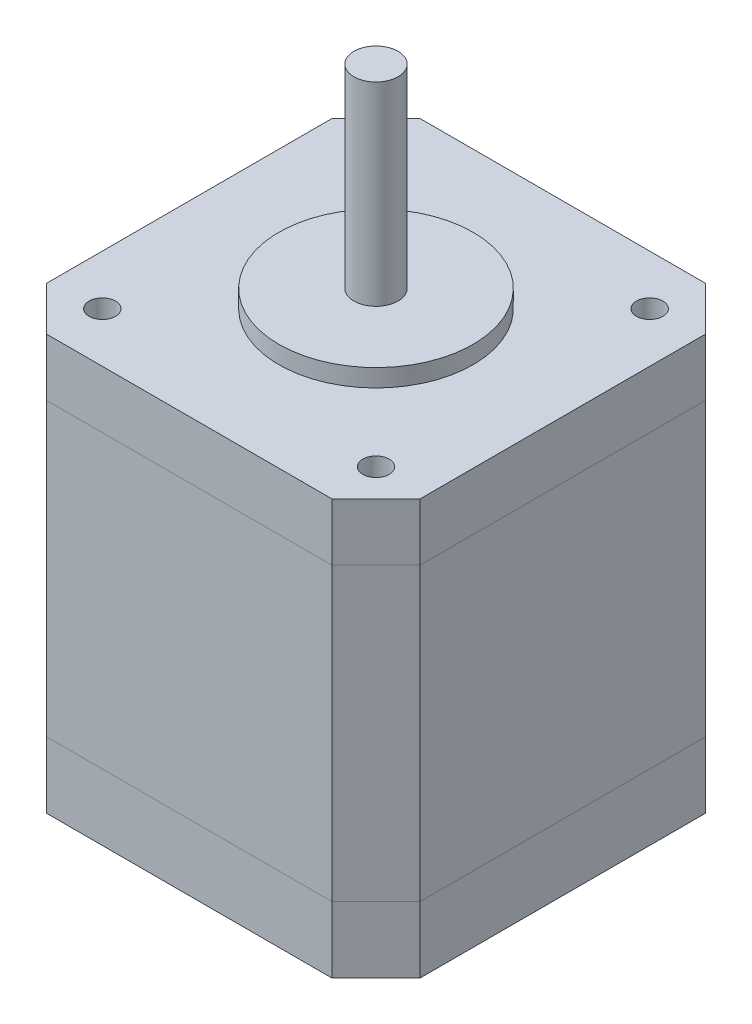
ISO-10303-21;
HEADER;
FILE_DESCRIPTION(('STEP AP214'),'2;1');
FILE_NAME('part.step','',(''),(''),'','','');
FILE_SCHEMA(('AUTOMOTIVE_DESIGN { 1 0 10303 214 1 1 1 1 }'));
ENDSEC;
DATA;
#1=APPLICATION_CONTEXT('core data for automotive mechanical design processes');
#2=APPLICATION_PROTOCOL_DEFINITION('international standard','automotive_design',2000,#1);
#3=PRODUCT_CONTEXT('',#1,'mechanical');
#4=PRODUCT('Part','Part','',(#3));
#5=PRODUCT_RELATED_PRODUCT_CATEGORY('part','',(#4));
#6=PRODUCT_DEFINITION_FORMATION('','',#4);
#7=PRODUCT_DEFINITION_CONTEXT('part definition',#1,'design');
#8=PRODUCT_DEFINITION('design','',#6,#7);
#9=PRODUCT_DEFINITION_SHAPE('','',#8);
#10=(LENGTH_UNIT() NAMED_UNIT(*) SI_UNIT(.MILLI.,.METRE.));
#11=(NAMED_UNIT(*) PLANE_ANGLE_UNIT() SI_UNIT($,.RADIAN.));
#12=(NAMED_UNIT(*) SI_UNIT($,.STERADIAN.) SOLID_ANGLE_UNIT());
#13=UNCERTAINTY_MEASURE_WITH_UNIT(LENGTH_MEASURE(1.E-05),#10,'distance_accuracy_value','');
#14=(GEOMETRIC_REPRESENTATION_CONTEXT(3) GLOBAL_UNCERTAINTY_ASSIGNED_CONTEXT((#13)) GLOBAL_UNIT_ASSIGNED_CONTEXT((#10,
#11,#12)) REPRESENTATION_CONTEXT('',''));
#15=CARTESIAN_POINT('',(0.,0.,0.));
#16=DIRECTION('',(0.,0.,1.));
#17=DIRECTION('',(1.,0.,0.));
#18=AXIS2_PLACEMENT_3D('',#15,#16,#17);
#19=CARTESIAN_POINT('',(-21.15,40.5,-16.15));
#20=DIRECTION('',(-1.,0.,0.));
#21=DIRECTION('',(0.,0.,1.));
#22=AXIS2_PLACEMENT_3D('',#19,#20,#21);
#23=PLANE('',#22);
#24=DIRECTION('',(0.,0.,-1.));
#25=VECTOR('',#24,1.);
#26=CARTESIAN_POINT('',(-21.15,7.5,-16.15));
#27=LINE('',#26,#25);
#28=CARTESIAN_POINT('',(-21.15,7.5,16.15));
#29=VERTEX_POINT('',#28);
#30=CARTESIAN_POINT('',(-21.15,7.5,-16.15));
#31=VERTEX_POINT('',#30);
#32=EDGE_CURVE('E140',#29,#31,#27,.T.);
#33=ORIENTED_EDGE('',*,*,#32,.F.);
#34=DIRECTION('',(0.,-1.,0.));
#35=VECTOR('',#34,1.);
#36=CARTESIAN_POINT('',(-21.15,40.5,16.15));
#37=LINE('',#36,#35);
#38=CARTESIAN_POINT('',(-21.15,40.5,16.15));
#39=VERTEX_POINT('',#38);
#40=EDGE_CURVE('E12',#39,#29,#37,.T.);
#41=ORIENTED_EDGE('',*,*,#40,.F.);
#42=DIRECTION('',(0.,0.,-1.));
#43=VECTOR('',#42,1.);
#44=CARTESIAN_POINT('',(-21.15,40.5,-16.15));
#45=LINE('',#44,#43);
#46=CARTESIAN_POINT('',(-21.15,40.5,-16.15));
#47=VERTEX_POINT('',#46);
#48=EDGE_CURVE('E160',#39,#47,#45,.T.);
#49=ORIENTED_EDGE('',*,*,#48,.T.);
#50=DIRECTION('',(0.,-1.,0.));
#51=VECTOR('',#50,1.);
#52=CARTESIAN_POINT('',(-21.15,40.5,-16.15));
#53=LINE('',#52,#51);
#54=EDGE_CURVE('E46',#47,#31,#53,.T.);
#55=ORIENTED_EDGE('',*,*,#54,.T.);
#56=EDGE_LOOP('',(#33,#41,#49,#55));
#57=FACE_BOUND('',#56,.T.);
#58=ADVANCED_FACE('F43',(#57),#23,.T.);
#59=CARTESIAN_POINT('',(-21.15,40.5,16.15));
#60=DIRECTION('',(-0.707106781186547,0.,0.707106781186547));
#61=DIRECTION('',(0.707106781186548,0.,0.707106781186548));
#62=AXIS2_PLACEMENT_3D('',#59,#60,#61);
#63=PLANE('',#62);
#64=DIRECTION('',(-0.707106781186548,0.,-0.707106781186548));
#65=VECTOR('',#64,1.);
#66=CARTESIAN_POINT('',(-21.15,7.5,16.15));
#67=LINE('',#66,#65);
#68=CARTESIAN_POINT('',(-16.15,7.5,21.15));
#69=VERTEX_POINT('',#68);
#70=EDGE_CURVE('E158',#69,#29,#67,.T.);
#71=ORIENTED_EDGE('',*,*,#70,.F.);
#72=DIRECTION('',(0.,-1.,0.));
#73=VECTOR('',#72,1.);
#74=CARTESIAN_POINT('',(-16.15,40.5,21.15));
#75=LINE('',#74,#73);
#76=CARTESIAN_POINT('',(-16.15,40.5,21.15));
#77=VERTEX_POINT('',#76);
#78=EDGE_CURVE('E52',#77,#69,#75,.T.);
#79=ORIENTED_EDGE('',*,*,#78,.F.);
#80=DIRECTION('',(-0.707106781186548,0.,-0.707106781186548));
#81=VECTOR('',#80,1.);
#82=CARTESIAN_POINT('',(-21.15,40.5,16.15));
#83=LINE('',#82,#81);
#84=EDGE_CURVE('E130',#77,#39,#83,.T.);
#85=ORIENTED_EDGE('',*,*,#84,.T.);
#86=ORIENTED_EDGE('',*,*,#40,.T.);
#87=EDGE_LOOP('',(#71,#79,#85,#86));
#88=FACE_BOUND('',#87,.T.);
#89=ADVANCED_FACE('F172',(#88),#63,.T.);
#90=CARTESIAN_POINT('',(-16.15,40.5,21.15));
#91=DIRECTION('',(0.,0.,1.));
#92=DIRECTION('',(1.,0.,0.));
#93=AXIS2_PLACEMENT_3D('',#90,#91,#92);
#94=PLANE('',#93);
#95=DIRECTION('',(-1.,0.,0.));
#96=VECTOR('',#95,1.);
#97=CARTESIAN_POINT('',(-16.15,7.5,21.15));
#98=LINE('',#97,#96);
#99=CARTESIAN_POINT('',(16.15,7.5,21.15));
#100=VERTEX_POINT('',#99);
#101=EDGE_CURVE('E117',#100,#69,#98,.T.);
#102=ORIENTED_EDGE('',*,*,#101,.F.);
#103=DIRECTION('',(0.,-1.,0.));
#104=VECTOR('',#103,1.);
#105=CARTESIAN_POINT('',(16.15,40.5,21.15));
#106=LINE('',#105,#104);
#107=CARTESIAN_POINT('',(16.15,40.5,21.15));
#108=VERTEX_POINT('',#107);
#109=EDGE_CURVE('E112',#108,#100,#106,.T.);
#110=ORIENTED_EDGE('',*,*,#109,.F.);
#111=DIRECTION('',(-1.,0.,0.));
#112=VECTOR('',#111,1.);
#113=CARTESIAN_POINT('',(-16.15,40.5,21.15));
#114=LINE('',#113,#112);
#115=EDGE_CURVE('E115',#108,#77,#114,.T.);
#116=ORIENTED_EDGE('',*,*,#115,.T.);
#117=ORIENTED_EDGE('',*,*,#78,.T.);
#118=EDGE_LOOP('',(#102,#110,#116,#117));
#119=FACE_BOUND('',#118,.T.);
#120=ADVANCED_FACE('F114',(#119),#94,.T.);
#121=CARTESIAN_POINT('',(16.15,40.5,21.15));
#122=DIRECTION('',(0.707106781186547,0.,0.707106781186547));
#123=DIRECTION('',(0.707106781186548,0.,-0.707106781186548));
#124=AXIS2_PLACEMENT_3D('',#121,#122,#123);
#125=PLANE('',#124);
#126=DIRECTION('',(-0.707106781186548,0.,0.707106781186548));
#127=VECTOR('',#126,1.);
#128=CARTESIAN_POINT('',(16.15,7.5,21.15));
#129=LINE('',#128,#127);
#130=CARTESIAN_POINT('',(21.15,7.5,16.15));
#131=VERTEX_POINT('',#130);
#132=EDGE_CURVE('E155',#131,#100,#129,.T.);
#133=ORIENTED_EDGE('',*,*,#132,.F.);
#134=DIRECTION('',(0.,-1.,0.));
#135=VECTOR('',#134,1.);
#136=CARTESIAN_POINT('',(21.15,40.5,16.15));
#137=LINE('',#136,#135);
#138=CARTESIAN_POINT('',(21.15,40.5,16.15));
#139=VERTEX_POINT('',#138);
#140=EDGE_CURVE('E122',#139,#131,#137,.T.);
#141=ORIENTED_EDGE('',*,*,#140,.F.);
#142=DIRECTION('',(-0.707106781186548,0.,0.707106781186548));
#143=VECTOR('',#142,1.);
#144=CARTESIAN_POINT('',(16.15,40.5,21.15));
#145=LINE('',#144,#143);
#146=EDGE_CURVE('E128',#139,#108,#145,.T.);
#147=ORIENTED_EDGE('',*,*,#146,.T.);
#148=ORIENTED_EDGE('',*,*,#109,.T.);
#149=EDGE_LOOP('',(#133,#141,#147,#148));
#150=FACE_BOUND('',#149,.T.);
#151=ADVANCED_FACE('F132',(#150),#125,.T.);
#152=CARTESIAN_POINT('',(21.15,40.5,16.15));
#153=DIRECTION('',(1.,0.,0.));
#154=DIRECTION('',(0.,0.,-1.));
#155=AXIS2_PLACEMENT_3D('',#152,#153,#154);
#156=PLANE('',#155);
#157=DIRECTION('',(0.,0.,1.));
#158=VECTOR('',#157,1.);
#159=CARTESIAN_POINT('',(21.15,7.5,16.15));
#160=LINE('',#159,#158);
#161=CARTESIAN_POINT('',(21.15,7.5,-16.15));
#162=VERTEX_POINT('',#161);
#163=EDGE_CURVE('E152',#162,#131,#160,.T.);
#164=ORIENTED_EDGE('',*,*,#163,.F.);
#165=DIRECTION('',(0.,-1.,0.));
#166=VECTOR('',#165,1.);
#167=CARTESIAN_POINT('',(21.15,40.5,-16.15));
#168=LINE('',#167,#166);
#169=CARTESIAN_POINT('',(21.15,40.5,-16.15));
#170=VERTEX_POINT('',#169);
#171=EDGE_CURVE('E164',#170,#162,#168,.T.);
#172=ORIENTED_EDGE('',*,*,#171,.F.);
#173=DIRECTION('',(0.,0.,1.));
#174=VECTOR('',#173,1.);
#175=CARTESIAN_POINT('',(21.15,40.5,16.15));
#176=LINE('',#175,#174);
#177=EDGE_CURVE('E133',#170,#139,#176,.T.);
#178=ORIENTED_EDGE('',*,*,#177,.T.);
#179=ORIENTED_EDGE('',*,*,#140,.T.);
#180=EDGE_LOOP('',(#164,#172,#178,#179));
#181=FACE_BOUND('',#180,.T.);
#182=ADVANCED_FACE('F185',(#181),#156,.T.);
#183=CARTESIAN_POINT('',(21.15,40.5,-16.15));
#184=DIRECTION('',(0.707106781186547,0.,-0.707106781186547));
#185=DIRECTION('',(-0.707106781186548,0.,-0.707106781186548));
#186=AXIS2_PLACEMENT_3D('',#183,#184,#185);
#187=PLANE('',#186);
#188=DIRECTION('',(0.707106781186548,0.,0.707106781186548));
#189=VECTOR('',#188,1.);
#190=CARTESIAN_POINT('',(21.15,7.5,-16.15));
#191=LINE('',#190,#189);
#192=CARTESIAN_POINT('',(16.15,7.5,-21.15));
#193=VERTEX_POINT('',#192);
#194=EDGE_CURVE('E149',#193,#162,#191,.T.);
#195=ORIENTED_EDGE('',*,*,#194,.F.);
#196=DIRECTION('',(0.,-1.,0.));
#197=VECTOR('',#196,1.);
#198=CARTESIAN_POINT('',(16.15,40.5,-21.15));
#199=LINE('',#198,#197);
#200=CARTESIAN_POINT('',(16.15,40.5,-21.15));
#201=VERTEX_POINT('',#200);
#202=EDGE_CURVE('E166',#201,#193,#199,.T.);
#203=ORIENTED_EDGE('',*,*,#202,.F.);
#204=DIRECTION('',(0.707106781186548,0.,0.707106781186548));
#205=VECTOR('',#204,1.);
#206=CARTESIAN_POINT('',(21.15,40.5,-16.15));
#207=LINE('',#206,#205);
#208=EDGE_CURVE('E135',#201,#170,#207,.T.);
#209=ORIENTED_EDGE('',*,*,#208,.T.);
#210=ORIENTED_EDGE('',*,*,#171,.T.);
#211=EDGE_LOOP('',(#195,#203,#209,#210));
#212=FACE_BOUND('',#211,.T.);
#213=ADVANCED_FACE('F188',(#212),#187,.T.);
#214=CARTESIAN_POINT('',(16.15,40.5,-21.15));
#215=DIRECTION('',(0.,0.,-1.));
#216=DIRECTION('',(-1.,0.,0.));
#217=AXIS2_PLACEMENT_3D('',#214,#215,#216);
#218=PLANE('',#217);
#219=DIRECTION('',(1.,0.,0.));
#220=VECTOR('',#219,1.);
#221=CARTESIAN_POINT('',(16.15,7.5,-21.15));
#222=LINE('',#221,#220);
#223=CARTESIAN_POINT('',(-16.15,7.5,-21.15));
#224=VERTEX_POINT('',#223);
#225=EDGE_CURVE('E146',#224,#193,#222,.T.);
#226=ORIENTED_EDGE('',*,*,#225,.F.);
#227=DIRECTION('',(0.,-1.,0.));
#228=VECTOR('',#227,1.);
#229=CARTESIAN_POINT('',(-16.15,40.5,-21.15));
#230=LINE('',#229,#228);
#231=CARTESIAN_POINT('',(-16.15,40.5,-21.15));
#232=VERTEX_POINT('',#231);
#233=EDGE_CURVE('E167',#232,#224,#230,.T.);
#234=ORIENTED_EDGE('',*,*,#233,.F.);
#235=DIRECTION('',(1.,0.,0.));
#236=VECTOR('',#235,1.);
#237=CARTESIAN_POINT('',(16.15,40.5,-21.15));
#238=LINE('',#237,#236);
#239=EDGE_CURVE('E263',#232,#201,#238,.T.);
#240=ORIENTED_EDGE('',*,*,#239,.T.);
#241=ORIENTED_EDGE('',*,*,#202,.T.);
#242=EDGE_LOOP('',(#226,#234,#240,#241));
#243=FACE_BOUND('',#242,.T.);
#244=ADVANCED_FACE('F192',(#243),#218,.T.);
#245=CARTESIAN_POINT('',(-16.15,40.5,-21.15));
#246=DIRECTION('',(-0.707106781186547,0.,-0.707106781186547));
#247=DIRECTION('',(-0.707106781186548,0.,0.707106781186548));
#248=AXIS2_PLACEMENT_3D('',#245,#246,#247);
#249=PLANE('',#248);
#250=DIRECTION('',(0.707106781186548,0.,-0.707106781186548));
#251=VECTOR('',#250,1.);
#252=CARTESIAN_POINT('',(-16.15,7.5,-21.15));
#253=LINE('',#252,#251);
#254=EDGE_CURVE('E143',#31,#224,#253,.T.);
#255=ORIENTED_EDGE('',*,*,#254,.F.);
#256=ORIENTED_EDGE('',*,*,#54,.F.);
#257=DIRECTION('',(0.707106781186548,0.,-0.707106781186548));
#258=VECTOR('',#257,1.);
#259=CARTESIAN_POINT('',(-16.15,40.5,-21.15));
#260=LINE('',#259,#258);
#261=EDGE_CURVE('E264',#47,#232,#260,.T.);
#262=ORIENTED_EDGE('',*,*,#261,.T.);
#263=ORIENTED_EDGE('',*,*,#233,.T.);
#264=EDGE_LOOP('',(#255,#256,#262,#263));
#265=FACE_BOUND('',#264,.T.);
#266=ADVANCED_FACE('F169',(#265),#249,.T.);
#267=CARTESIAN_POINT('',(-21.15,40.5,21.15));
#268=DIRECTION('',(0.,1.,0.));
#269=DIRECTION('',(0.,0.,1.));
#270=AXIS2_PLACEMENT_3D('',#267,#268,#269);
#271=PLANE('',#270);
#272=ORIENTED_EDGE('',*,*,#48,.F.);
#273=ORIENTED_EDGE('',*,*,#84,.F.);
#274=ORIENTED_EDGE('',*,*,#115,.F.);
#275=ORIENTED_EDGE('',*,*,#146,.F.);
#276=ORIENTED_EDGE('',*,*,#177,.F.);
#277=ORIENTED_EDGE('',*,*,#208,.F.);
#278=ORIENTED_EDGE('',*,*,#239,.F.);
#279=ORIENTED_EDGE('',*,*,#261,.F.);
#280=EDGE_LOOP('',(#272,#273,#274,#275,#276,#277,#278,#279));
#281=FACE_BOUND('',#280,.T.);
#282=ADVANCED_FACE('F126',(#281),#271,.T.);
#283=CARTESIAN_POINT('',(-21.15,7.5,21.15));
#284=DIRECTION('',(0.,1.,0.));
#285=DIRECTION('',(0.,0.,1.));
#286=AXIS2_PLACEMENT_3D('',#283,#284,#285);
#287=PLANE('',#286);
#288=ORIENTED_EDGE('',*,*,#32,.T.);
#289=ORIENTED_EDGE('',*,*,#254,.T.);
#290=ORIENTED_EDGE('',*,*,#225,.T.);
#291=ORIENTED_EDGE('',*,*,#194,.T.);
#292=ORIENTED_EDGE('',*,*,#163,.T.);
#293=ORIENTED_EDGE('',*,*,#132,.T.);
#294=ORIENTED_EDGE('',*,*,#101,.T.);
#295=ORIENTED_EDGE('',*,*,#70,.T.);
#296=EDGE_LOOP('',(#288,#289,#290,#291,#292,#293,#294,#295));
#297=FACE_BOUND('',#296,.T.);
#298=ADVANCED_FACE('F171',(#297),#287,.F.);
#299=CLOSED_SHELL('',(#58,#89,#120,#151,#182,#213,#244,#266,#282,#298));
#300=MANIFOLD_SOLID_BREP('B2',#299);
#301=CARTESIAN_POINT('',(0.,49.,0.));
#302=DIRECTION('',(0.,1.,0.));
#303=DIRECTION('',(0.,0.,1.));
#304=AXIS2_PLACEMENT_3D('',#301,#302,#303);
#305=PLANE('',#304);
#306=CARTESIAN_POINT('',(0.,49.,0.));
#307=DIRECTION('',(0.,1.,0.));
#308=DIRECTION('',(0.,0.,1.));
#309=AXIS2_PLACEMENT_3D('',#306,#307,#308);
#310=CIRCLE('',#309,11.);
#311=CARTESIAN_POINT('',(0.,49.,11.));
#312=VERTEX_POINT('',#311);
#313=EDGE_CURVE('E377',#312,#312,#310,.T.);
#314=ORIENTED_EDGE('',*,*,#313,.T.);
#315=EDGE_LOOP('',(#314));
#316=FACE_BOUND('',#315,.T.);
#317=CARTESIAN_POINT('',(0.,49.,0.));
#318=DIRECTION('',(0.,1.,0.));
#319=DIRECTION('',(0.,0.,1.));
#320=AXIS2_PLACEMENT_3D('',#317,#318,#319);
#321=CIRCLE('',#320,2.5);
#322=CARTESIAN_POINT('',(0.,49.,2.5));
#323=VERTEX_POINT('',#322);
#324=EDGE_CURVE('E376',#323,#323,#321,.F.);
#325=ORIENTED_EDGE('',*,*,#324,.T.);
#326=EDGE_LOOP('',(#325));
#327=FACE_BOUND('',#326,.T.);
#328=ADVANCED_FACE('F279',(#316,#327),#305,.T.);
#329=CARTESIAN_POINT('',(21.15,47.,-21.15));
#330=DIRECTION('',(0.,-1.,0.));
#331=DIRECTION('',(0.,0.,-1.));
#332=AXIS2_PLACEMENT_3D('',#329,#330,#331);
#333=PLANE('',#332);
#334=CARTESIAN_POINT('',(15.5,47.,15.5));
#335=DIRECTION('',(0.,1.,0.));
#336=DIRECTION('',(0.,0.,1.));
#337=AXIS2_PLACEMENT_3D('',#334,#335,#336);
#338=CIRCLE('',#337,1.5);
#339=CARTESIAN_POINT('',(15.5,47.,17.));
#340=VERTEX_POINT('',#339);
#341=EDGE_CURVE('E402',#340,#340,#338,.T.);
#342=ORIENTED_EDGE('',*,*,#341,.F.);
#343=EDGE_LOOP('',(#342));
#344=FACE_BOUND('',#343,.T.);
#345=CARTESIAN_POINT('',(-15.5,47.,15.5));
#346=DIRECTION('',(0.,1.,0.));
#347=DIRECTION('',(0.,0.,1.));
#348=AXIS2_PLACEMENT_3D('',#345,#346,#347);
#349=CIRCLE('',#348,1.5);
#350=CARTESIAN_POINT('',(-15.5,47.,17.));
#351=VERTEX_POINT('',#350);
#352=EDGE_CURVE('E396',#351,#351,#349,.T.);
#353=ORIENTED_EDGE('',*,*,#352,.F.);
#354=EDGE_LOOP('',(#353));
#355=FACE_BOUND('',#354,.T.);
#356=CARTESIAN_POINT('',(15.5,47.,-15.5));
#357=DIRECTION('',(0.,1.,0.));
#358=DIRECTION('',(0.,0.,1.));
#359=AXIS2_PLACEMENT_3D('',#356,#357,#358);
#360=CIRCLE('',#359,1.5);
#361=CARTESIAN_POINT('',(15.5,47.,-14.));
#362=VERTEX_POINT('',#361);
#363=EDGE_CURVE('E390',#362,#362,#360,.T.);
#364=ORIENTED_EDGE('',*,*,#363,.F.);
#365=EDGE_LOOP('',(#364));
#366=FACE_BOUND('',#365,.T.);
#367=CARTESIAN_POINT('',(-15.5,47.,-15.5));
#368=DIRECTION('',(0.,1.,0.));
#369=DIRECTION('',(0.,0.,1.));
#370=AXIS2_PLACEMENT_3D('',#367,#368,#369);
#371=CIRCLE('',#370,1.5);
#372=CARTESIAN_POINT('',(-15.5,47.,-14.));
#373=VERTEX_POINT('',#372);
#374=EDGE_CURVE('E383',#373,#373,#371,.T.);
#375=ORIENTED_EDGE('',*,*,#374,.F.);
#376=EDGE_LOOP('',(#375));
#377=FACE_BOUND('',#376,.T.);
#378=DIRECTION('',(-1.,0.,0.));
#379=VECTOR('',#378,1.);
#380=CARTESIAN_POINT('',(-16.15,47.,-21.15));
#381=LINE('',#380,#379);
#382=CARTESIAN_POINT('',(16.15,47.,-21.15));
#383=VERTEX_POINT('',#382);
#384=CARTESIAN_POINT('',(-16.15,47.,-21.15));
#385=VERTEX_POINT('',#384);
#386=EDGE_CURVE('E356',#383,#385,#381,.T.);
#387=ORIENTED_EDGE('',*,*,#386,.T.);
#388=DIRECTION('',(-0.707106781186548,0.,0.707106781186548));
#389=VECTOR('',#388,1.);
#390=CARTESIAN_POINT('',(-21.15,47.,-16.15));
#391=LINE('',#390,#389);
#392=CARTESIAN_POINT('',(-21.15,47.,-16.15));
#393=VERTEX_POINT('',#392);
#394=EDGE_CURVE('E326',#385,#393,#391,.T.);
#395=ORIENTED_EDGE('',*,*,#394,.T.);
#396=DIRECTION('',(0.,0.,1.));
#397=VECTOR('',#396,1.);
#398=CARTESIAN_POINT('',(-21.15,47.,-16.15));
#399=LINE('',#398,#397);
#400=CARTESIAN_POINT('',(-21.15,47.,16.15));
#401=VERTEX_POINT('',#400);
#402=EDGE_CURVE('E353',#393,#401,#399,.T.);
#403=ORIENTED_EDGE('',*,*,#402,.T.);
#404=DIRECTION('',(0.707106781186548,0.,0.707106781186548));
#405=VECTOR('',#404,1.);
#406=CARTESIAN_POINT('',(-21.15,47.,16.15));
#407=LINE('',#406,#405);
#408=CARTESIAN_POINT('',(-16.15,47.,21.15));
#409=VERTEX_POINT('',#408);
#410=EDGE_CURVE('E369',#401,#409,#407,.T.);
#411=ORIENTED_EDGE('',*,*,#410,.T.);
#412=DIRECTION('',(1.,0.,0.));
#413=VECTOR('',#412,1.);
#414=CARTESIAN_POINT('',(-16.15,47.,21.15));
#415=LINE('',#414,#413);
#416=CARTESIAN_POINT('',(16.15,47.,21.15));
#417=VERTEX_POINT('',#416);
#418=EDGE_CURVE('E371',#409,#417,#415,.T.);
#419=ORIENTED_EDGE('',*,*,#418,.T.);
#420=DIRECTION('',(0.707106781186548,0.,-0.707106781186548));
#421=VECTOR('',#420,1.);
#422=CARTESIAN_POINT('',(16.15,47.,21.15));
#423=LINE('',#422,#421);
#424=CARTESIAN_POINT('',(21.15,47.,16.15));
#425=VERTEX_POINT('',#424);
#426=EDGE_CURVE('E443',#417,#425,#423,.T.);
#427=ORIENTED_EDGE('',*,*,#426,.T.);
#428=DIRECTION('',(0.,0.,-1.));
#429=VECTOR('',#428,1.);
#430=CARTESIAN_POINT('',(21.15,47.,-16.15));
#431=LINE('',#430,#429);
#432=CARTESIAN_POINT('',(21.15,47.,-16.15));
#433=VERTEX_POINT('',#432);
#434=EDGE_CURVE('E441',#425,#433,#431,.T.);
#435=ORIENTED_EDGE('',*,*,#434,.T.);
#436=DIRECTION('',(-0.707106781186548,0.,-0.707106781186548));
#437=VECTOR('',#436,1.);
#438=CARTESIAN_POINT('',(16.15,47.,-21.15));
#439=LINE('',#438,#437);
#440=EDGE_CURVE('E334',#433,#383,#439,.T.);
#441=ORIENTED_EDGE('',*,*,#440,.T.);
#442=EDGE_LOOP('',(#387,#395,#403,#411,#419,#427,#435,#441));
#443=FACE_BOUND('',#442,.T.);
#444=CARTESIAN_POINT('',(0.,47.,0.));
#445=DIRECTION('',(0.,-1.,0.));
#446=DIRECTION('',(0.,0.,-1.));
#447=AXIS2_PLACEMENT_3D('',#444,#445,#446);
#448=CIRCLE('',#447,11.);
#449=CARTESIAN_POINT('',(0.,47.,-11.));
#450=VERTEX_POINT('',#449);
#451=EDGE_CURVE('E384',#450,#450,#448,.F.);
#452=ORIENTED_EDGE('',*,*,#451,.F.);
#453=EDGE_LOOP('',(#452));
#454=FACE_BOUND('',#453,.T.);
#455=ADVANCED_FACE('F350',(#344,#355,#366,#377,#443,#454),#333,.F.);
#456=CARTESIAN_POINT('',(-16.15,47.,-21.15));
#457=DIRECTION('',(0.,0.,1.));
#458=DIRECTION('',(1.,0.,0.));
#459=AXIS2_PLACEMENT_3D('',#456,#457,#458);
#460=PLANE('',#459);
#461=DIRECTION('',(0.,-1.,0.));
#462=VECTOR('',#461,1.);
#463=CARTESIAN_POINT('',(16.15,47.,-21.15));
#464=LINE('',#463,#462);
#465=CARTESIAN_POINT('',(16.15,40.5,-21.15));
#466=VERTEX_POINT('',#465);
#467=EDGE_CURVE('E283',#383,#466,#464,.T.);
#468=ORIENTED_EDGE('',*,*,#467,.T.);
#469=DIRECTION('',(1.,0.,0.));
#470=VECTOR('',#469,1.);
#471=CARTESIAN_POINT('',(16.15,40.5,-21.15));
#472=LINE('',#471,#470);
#473=CARTESIAN_POINT('',(-16.15,40.5,-21.15));
#474=VERTEX_POINT('',#473);
#475=EDGE_CURVE('E415',#474,#466,#472,.T.);
#476=ORIENTED_EDGE('',*,*,#475,.F.);
#477=DIRECTION('',(0.,-1.,0.));
#478=VECTOR('',#477,1.);
#479=CARTESIAN_POINT('',(-16.15,47.,-21.15));
#480=LINE('',#479,#478);
#481=EDGE_CURVE('E364',#385,#474,#480,.T.);
#482=ORIENTED_EDGE('',*,*,#481,.F.);
#483=ORIENTED_EDGE('',*,*,#386,.F.);
#484=EDGE_LOOP('',(#468,#476,#482,#483));
#485=FACE_BOUND('',#484,.T.);
#486=ADVANCED_FACE('F281',(#485),#460,.F.);
#487=CARTESIAN_POINT('',(-21.15,47.,-16.15));
#488=DIRECTION('',(0.707106781186547,0.,0.707106781186547));
#489=DIRECTION('',(0.707106781186548,0.,-0.707106781186548));
#490=AXIS2_PLACEMENT_3D('',#487,#488,#489);
#491=PLANE('',#490);
#492=ORIENTED_EDGE('',*,*,#481,.T.);
#493=DIRECTION('',(0.707106781186548,0.,-0.707106781186548));
#494=VECTOR('',#493,1.);
#495=CARTESIAN_POINT('',(-16.15,40.5,-21.15));
#496=LINE('',#495,#494);
#497=CARTESIAN_POINT('',(-21.15,40.5,-16.15));
#498=VERTEX_POINT('',#497);
#499=EDGE_CURVE('E316',#498,#474,#496,.T.);
#500=ORIENTED_EDGE('',*,*,#499,.F.);
#501=DIRECTION('',(0.,-1.,0.));
#502=VECTOR('',#501,1.);
#503=CARTESIAN_POINT('',(-21.15,47.,-16.15));
#504=LINE('',#503,#502);
#505=EDGE_CURVE('E360',#393,#498,#504,.T.);
#506=ORIENTED_EDGE('',*,*,#505,.F.);
#507=ORIENTED_EDGE('',*,*,#394,.F.);
#508=EDGE_LOOP('',(#492,#500,#506,#507));
#509=FACE_BOUND('',#508,.T.);
#510=ADVANCED_FACE('F361',(#509),#491,.F.);
#511=CARTESIAN_POINT('',(-21.15,47.,-16.15));
#512=DIRECTION('',(1.,0.,0.));
#513=DIRECTION('',(0.,0.,-1.));
#514=AXIS2_PLACEMENT_3D('',#511,#512,#513);
#515=PLANE('',#514);
#516=ORIENTED_EDGE('',*,*,#505,.T.);
#517=DIRECTION('',(0.,0.,-1.));
#518=VECTOR('',#517,1.);
#519=CARTESIAN_POINT('',(-21.15,40.5,-16.15));
#520=LINE('',#519,#518);
#521=CARTESIAN_POINT('',(-21.15,40.5,16.15));
#522=VERTEX_POINT('',#521);
#523=EDGE_CURVE('E319',#522,#498,#520,.T.);
#524=ORIENTED_EDGE('',*,*,#523,.F.);
#525=DIRECTION('',(0.,-1.,0.));
#526=VECTOR('',#525,1.);
#527=CARTESIAN_POINT('',(-21.15,47.,16.15));
#528=LINE('',#527,#526);
#529=EDGE_CURVE('E363',#401,#522,#528,.T.);
#530=ORIENTED_EDGE('',*,*,#529,.F.);
#531=ORIENTED_EDGE('',*,*,#402,.F.);
#532=EDGE_LOOP('',(#516,#524,#530,#531));
#533=FACE_BOUND('',#532,.T.);
#534=ADVANCED_FACE('F366',(#533),#515,.F.);
#535=CARTESIAN_POINT('',(-21.15,47.,16.15));
#536=DIRECTION('',(0.707106781186547,0.,-0.707106781186547));
#537=DIRECTION('',(-0.707106781186548,0.,-0.707106781186548));
#538=AXIS2_PLACEMENT_3D('',#535,#536,#537);
#539=PLANE('',#538);
#540=ORIENTED_EDGE('',*,*,#529,.T.);
#541=DIRECTION('',(-0.707106781186548,0.,-0.707106781186548));
#542=VECTOR('',#541,1.);
#543=CARTESIAN_POINT('',(-21.15,40.5,16.15));
#544=LINE('',#543,#542);
#545=CARTESIAN_POINT('',(-16.15,40.5,21.15));
#546=VERTEX_POINT('',#545);
#547=EDGE_CURVE('E41',#546,#522,#544,.T.);
#548=ORIENTED_EDGE('',*,*,#547,.F.);
#549=DIRECTION('',(0.,-1.,0.));
#550=VECTOR('',#549,1.);
#551=CARTESIAN_POINT('',(-16.15,47.,21.15));
#552=LINE('',#551,#550);
#553=EDGE_CURVE('E421',#409,#546,#552,.T.);
#554=ORIENTED_EDGE('',*,*,#553,.F.);
#555=ORIENTED_EDGE('',*,*,#410,.F.);
#556=EDGE_LOOP('',(#540,#548,#554,#555));
#557=FACE_BOUND('',#556,.T.);
#558=ADVANCED_FACE('F464',(#557),#539,.F.);
#559=CARTESIAN_POINT('',(-16.15,47.,21.15));
#560=DIRECTION('',(0.,0.,-1.));
#561=DIRECTION('',(-1.,0.,0.));
#562=AXIS2_PLACEMENT_3D('',#559,#560,#561);
#563=PLANE('',#562);
#564=ORIENTED_EDGE('',*,*,#553,.T.);
#565=DIRECTION('',(-1.,0.,0.));
#566=VECTOR('',#565,1.);
#567=CARTESIAN_POINT('',(-16.15,40.5,21.15));
#568=LINE('',#567,#566);
#569=CARTESIAN_POINT('',(16.15,40.5,21.15));
#570=VERTEX_POINT('',#569);
#571=EDGE_CURVE('E289',#570,#546,#568,.T.);
#572=ORIENTED_EDGE('',*,*,#571,.F.);
#573=DIRECTION('',(0.,-1.,0.));
#574=VECTOR('',#573,1.);
#575=CARTESIAN_POINT('',(16.15,47.,21.15));
#576=LINE('',#575,#574);
#577=EDGE_CURVE('E424',#417,#570,#576,.T.);
#578=ORIENTED_EDGE('',*,*,#577,.F.);
#579=ORIENTED_EDGE('',*,*,#418,.F.);
#580=EDGE_LOOP('',(#564,#572,#578,#579));
#581=FACE_BOUND('',#580,.T.);
#582=ADVANCED_FACE('F451',(#581),#563,.F.);
#583=CARTESIAN_POINT('',(16.15,47.,21.15));
#584=DIRECTION('',(-0.707106781186547,0.,-0.707106781186547));
#585=DIRECTION('',(-0.707106781186548,0.,0.707106781186548));
#586=AXIS2_PLACEMENT_3D('',#583,#584,#585);
#587=PLANE('',#586);
#588=ORIENTED_EDGE('',*,*,#577,.T.);
#589=DIRECTION('',(-0.707106781186548,0.,0.707106781186548));
#590=VECTOR('',#589,1.);
#591=CARTESIAN_POINT('',(16.15,40.5,21.15));
#592=LINE('',#591,#590);
#593=CARTESIAN_POINT('',(21.15,40.5,16.15));
#594=VERTEX_POINT('',#593);
#595=EDGE_CURVE('E409',#594,#570,#592,.T.);
#596=ORIENTED_EDGE('',*,*,#595,.F.);
#597=DIRECTION('',(0.,-1.,0.));
#598=VECTOR('',#597,1.);
#599=CARTESIAN_POINT('',(21.15,47.,16.15));
#600=LINE('',#599,#598);
#601=EDGE_CURVE('E427',#425,#594,#600,.T.);
#602=ORIENTED_EDGE('',*,*,#601,.F.);
#603=ORIENTED_EDGE('',*,*,#426,.F.);
#604=EDGE_LOOP('',(#588,#596,#602,#603));
#605=FACE_BOUND('',#604,.T.);
#606=ADVANCED_FACE('F454',(#605),#587,.F.);
#607=CARTESIAN_POINT('',(21.15,47.,-16.15));
#608=DIRECTION('',(-1.,0.,0.));
#609=DIRECTION('',(0.,0.,1.));
#610=AXIS2_PLACEMENT_3D('',#607,#608,#609);
#611=PLANE('',#610);
#612=ORIENTED_EDGE('',*,*,#601,.T.);
#613=DIRECTION('',(0.,0.,1.));
#614=VECTOR('',#613,1.);
#615=CARTESIAN_POINT('',(21.15,40.5,16.15));
#616=LINE('',#615,#614);
#617=CARTESIAN_POINT('',(21.15,40.5,-16.15));
#618=VERTEX_POINT('',#617);
#619=EDGE_CURVE('E411',#618,#594,#616,.T.);
#620=ORIENTED_EDGE('',*,*,#619,.F.);
#621=DIRECTION('',(0.,-1.,0.));
#622=VECTOR('',#621,1.);
#623=CARTESIAN_POINT('',(21.15,47.,-16.15));
#624=LINE('',#623,#622);
#625=EDGE_CURVE('E429',#433,#618,#624,.T.);
#626=ORIENTED_EDGE('',*,*,#625,.F.);
#627=ORIENTED_EDGE('',*,*,#434,.F.);
#628=EDGE_LOOP('',(#612,#620,#626,#627));
#629=FACE_BOUND('',#628,.T.);
#630=ADVANCED_FACE('F458',(#629),#611,.F.);
#631=CARTESIAN_POINT('',(16.15,47.,-21.15));
#632=DIRECTION('',(-0.707106781186547,0.,0.707106781186547));
#633=DIRECTION('',(0.707106781186548,0.,0.707106781186548));
#634=AXIS2_PLACEMENT_3D('',#631,#632,#633);
#635=PLANE('',#634);
#636=ORIENTED_EDGE('',*,*,#625,.T.);
#637=DIRECTION('',(0.707106781186548,0.,0.707106781186548));
#638=VECTOR('',#637,1.);
#639=CARTESIAN_POINT('',(21.15,40.5,-16.15));
#640=LINE('',#639,#638);
#641=EDGE_CURVE('E413',#466,#618,#640,.T.);
#642=ORIENTED_EDGE('',*,*,#641,.F.);
#643=ORIENTED_EDGE('',*,*,#467,.F.);
#644=ORIENTED_EDGE('',*,*,#440,.F.);
#645=EDGE_LOOP('',(#636,#642,#643,#644));
#646=FACE_BOUND('',#645,.T.);
#647=ADVANCED_FACE('F459',(#646),#635,.F.);
#648=CARTESIAN_POINT('',(0.,49.,0.));
#649=DIRECTION('',(0.,-1.,0.));
#650=DIRECTION('',(0.,0.,-1.));
#651=AXIS2_PLACEMENT_3D('',#648,#649,#650);
#652=CYLINDRICAL_SURFACE('',#651,11.);
#653=ORIENTED_EDGE('',*,*,#313,.F.);
#654=EDGE_LOOP('',(#653));
#655=FACE_BOUND('',#654,.T.);
#656=ORIENTED_EDGE('',*,*,#451,.T.);
#657=EDGE_LOOP('',(#656));
#658=FACE_BOUND('',#657,.T.);
#659=ADVANCED_FACE('F484',(#655,#658),#652,.T.);
#660=CARTESIAN_POINT('',(0.,71.,0.));
#661=DIRECTION('',(0.,1.,0.));
#662=DIRECTION('',(0.,0.,1.));
#663=AXIS2_PLACEMENT_3D('',#660,#661,#662);
#664=PLANE('',#663);
#665=CARTESIAN_POINT('',(0.,71.,0.));
#666=DIRECTION('',(0.,1.,0.));
#667=DIRECTION('',(0.,0.,1.));
#668=AXIS2_PLACEMENT_3D('',#665,#666,#667);
#669=CIRCLE('',#668,2.5);
#670=CARTESIAN_POINT('',(0.,71.,2.5));
#671=VERTEX_POINT('',#670);
#672=EDGE_CURVE('E380',#671,#671,#669,.T.);
#673=ORIENTED_EDGE('',*,*,#672,.T.);
#674=EDGE_LOOP('',(#673));
#675=FACE_BOUND('',#674,.T.);
#676=ADVANCED_FACE('F485',(#675),#664,.T.);
#677=CARTESIAN_POINT('',(0.,71.,0.));
#678=DIRECTION('',(0.,-1.,0.));
#679=DIRECTION('',(0.,0.,-1.));
#680=AXIS2_PLACEMENT_3D('',#677,#678,#679);
#681=CYLINDRICAL_SURFACE('',#680,2.5);
#682=ORIENTED_EDGE('',*,*,#324,.F.);
#683=EDGE_LOOP('',(#682));
#684=FACE_BOUND('',#683,.T.);
#685=ORIENTED_EDGE('',*,*,#672,.F.);
#686=EDGE_LOOP('',(#685));
#687=FACE_BOUND('',#686,.T.);
#688=ADVANCED_FACE('F488',(#684,#687),#681,.T.);
#689=CARTESIAN_POINT('',(-15.5,42.5,-15.5));
#690=DIRECTION('',(0.,1.,0.));
#691=DIRECTION('',(0.,0.,1.));
#692=AXIS2_PLACEMENT_3D('',#689,#690,#691);
#693=CYLINDRICAL_SURFACE('',#692,1.5);
#694=CARTESIAN_POINT('',(-15.5,42.5,-15.5));
#695=DIRECTION('',(0.,1.,0.));
#696=DIRECTION('',(0.,0.,1.));
#697=AXIS2_PLACEMENT_3D('',#694,#695,#696);
#698=CIRCLE('',#697,1.5);
#699=CARTESIAN_POINT('',(-15.5,42.5,-14.));
#700=VERTEX_POINT('',#699);
#701=EDGE_CURVE('E387',#700,#700,#698,.T.);
#702=ORIENTED_EDGE('',*,*,#701,.F.);
#703=EDGE_LOOP('',(#702));
#704=FACE_BOUND('',#703,.T.);
#705=ORIENTED_EDGE('',*,*,#374,.T.);
#706=EDGE_LOOP('',(#705));
#707=FACE_BOUND('',#706,.T.);
#708=ADVANCED_FACE('F490',(#704,#707),#693,.F.);
#709=CARTESIAN_POINT('',(-15.5,42.5,-15.5));
#710=DIRECTION('',(0.,1.,0.));
#711=DIRECTION('',(0.,0.,1.));
#712=AXIS2_PLACEMENT_3D('',#709,#710,#711);
#713=PLANE('',#712);
#714=ORIENTED_EDGE('',*,*,#701,.T.);
#715=EDGE_LOOP('',(#714));
#716=FACE_BOUND('',#715,.T.);
#717=ADVANCED_FACE('F493',(#716),#713,.T.);
#718=CARTESIAN_POINT('',(15.5,42.5,-15.5));
#719=DIRECTION('',(0.,1.,0.));
#720=DIRECTION('',(0.,0.,1.));
#721=AXIS2_PLACEMENT_3D('',#718,#719,#720);
#722=CYLINDRICAL_SURFACE('',#721,1.5);
#723=CARTESIAN_POINT('',(15.5,42.5,-15.5));
#724=DIRECTION('',(0.,1.,0.));
#725=DIRECTION('',(0.,0.,1.));
#726=AXIS2_PLACEMENT_3D('',#723,#724,#725);
#727=CIRCLE('',#726,1.5);
#728=CARTESIAN_POINT('',(15.5,42.5,-14.));
#729=VERTEX_POINT('',#728);
#730=EDGE_CURVE('E393',#729,#729,#727,.T.);
#731=ORIENTED_EDGE('',*,*,#730,.F.);
#732=EDGE_LOOP('',(#731));
#733=FACE_BOUND('',#732,.T.);
#734=ORIENTED_EDGE('',*,*,#363,.T.);
#735=EDGE_LOOP('',(#734));
#736=FACE_BOUND('',#735,.T.);
#737=ADVANCED_FACE('F497',(#733,#736),#722,.F.);
#738=CARTESIAN_POINT('',(15.5,42.5,-15.5));
#739=DIRECTION('',(0.,1.,0.));
#740=DIRECTION('',(0.,0.,1.));
#741=AXIS2_PLACEMENT_3D('',#738,#739,#740);
#742=PLANE('',#741);
#743=ORIENTED_EDGE('',*,*,#730,.T.);
#744=EDGE_LOOP('',(#743));
#745=FACE_BOUND('',#744,.T.);
#746=ADVANCED_FACE('F501',(#745),#742,.T.);
#747=CARTESIAN_POINT('',(-15.5,42.5,15.5));
#748=DIRECTION('',(0.,1.,0.));
#749=DIRECTION('',(0.,0.,1.));
#750=AXIS2_PLACEMENT_3D('',#747,#748,#749);
#751=CYLINDRICAL_SURFACE('',#750,1.5);
#752=CARTESIAN_POINT('',(-15.5,42.5,15.5));
#753=DIRECTION('',(0.,1.,0.));
#754=DIRECTION('',(0.,0.,1.));
#755=AXIS2_PLACEMENT_3D('',#752,#753,#754);
#756=CIRCLE('',#755,1.5);
#757=CARTESIAN_POINT('',(-15.5,42.5,17.));
#758=VERTEX_POINT('',#757);
#759=EDGE_CURVE('E399',#758,#758,#756,.T.);
#760=ORIENTED_EDGE('',*,*,#759,.F.);
#761=EDGE_LOOP('',(#760));
#762=FACE_BOUND('',#761,.T.);
#763=ORIENTED_EDGE('',*,*,#352,.T.);
#764=EDGE_LOOP('',(#763));
#765=FACE_BOUND('',#764,.T.);
#766=ADVANCED_FACE('F505',(#762,#765),#751,.F.);
#767=CARTESIAN_POINT('',(-15.5,42.5,15.5));
#768=DIRECTION('',(0.,1.,0.));
#769=DIRECTION('',(0.,0.,1.));
#770=AXIS2_PLACEMENT_3D('',#767,#768,#769);
#771=PLANE('',#770);
#772=ORIENTED_EDGE('',*,*,#759,.T.);
#773=EDGE_LOOP('',(#772));
#774=FACE_BOUND('',#773,.T.);
#775=ADVANCED_FACE('F509',(#774),#771,.T.);
#776=CARTESIAN_POINT('',(15.5,42.5,15.5));
#777=DIRECTION('',(0.,1.,0.));
#778=DIRECTION('',(0.,0.,1.));
#779=AXIS2_PLACEMENT_3D('',#776,#777,#778);
#780=CYLINDRICAL_SURFACE('',#779,1.5);
#781=CARTESIAN_POINT('',(15.5,42.5,15.5));
#782=DIRECTION('',(0.,1.,0.));
#783=DIRECTION('',(0.,0.,1.));
#784=AXIS2_PLACEMENT_3D('',#781,#782,#783);
#785=CIRCLE('',#784,1.5);
#786=CARTESIAN_POINT('',(15.5,42.5,17.));
#787=VERTEX_POINT('',#786);
#788=EDGE_CURVE('E405',#787,#787,#785,.T.);
#789=ORIENTED_EDGE('',*,*,#788,.F.);
#790=EDGE_LOOP('',(#789));
#791=FACE_BOUND('',#790,.T.);
#792=ORIENTED_EDGE('',*,*,#341,.T.);
#793=EDGE_LOOP('',(#792));
#794=FACE_BOUND('',#793,.T.);
#795=ADVANCED_FACE('F513',(#791,#794),#780,.F.);
#796=CARTESIAN_POINT('',(15.5,42.5,15.5));
#797=DIRECTION('',(0.,1.,0.));
#798=DIRECTION('',(0.,0.,1.));
#799=AXIS2_PLACEMENT_3D('',#796,#797,#798);
#800=PLANE('',#799);
#801=ORIENTED_EDGE('',*,*,#788,.T.);
#802=EDGE_LOOP('',(#801));
#803=FACE_BOUND('',#802,.T.);
#804=ADVANCED_FACE('F517',(#803),#800,.T.);
#805=CARTESIAN_POINT('',(-21.15,40.5,21.15));
#806=DIRECTION('',(0.,1.,0.));
#807=DIRECTION('',(0.,0.,1.));
#808=AXIS2_PLACEMENT_3D('',#805,#806,#807);
#809=PLANE('',#808);
#810=ORIENTED_EDGE('',*,*,#523,.T.);
#811=ORIENTED_EDGE('',*,*,#499,.T.);
#812=ORIENTED_EDGE('',*,*,#475,.T.);
#813=ORIENTED_EDGE('',*,*,#641,.T.);
#814=ORIENTED_EDGE('',*,*,#619,.T.);
#815=ORIENTED_EDGE('',*,*,#595,.T.);
#816=ORIENTED_EDGE('',*,*,#571,.T.);
#817=ORIENTED_EDGE('',*,*,#547,.T.);
#818=EDGE_LOOP('',(#810,#811,#812,#813,#814,#815,#816,#817));
#819=FACE_BOUND('',#818,.T.);
#820=ADVANCED_FACE('F462',(#819),#809,.F.);
#821=CLOSED_SHELL('',(#328,#455,#486,#510,#534,#558,#582,#606,#630,#647,#659,#676,#688,#708,
#717,#737,#746,#766,#775,#795,#804,#820));
#822=MANIFOLD_SOLID_BREP('B6',#821);
#823=CARTESIAN_POINT('',(0.,-9.5,0.));
#824=DIRECTION('',(0.,1.,0.));
#825=DIRECTION('',(0.,0.,1.));
#826=AXIS2_PLACEMENT_3D('',#823,#824,#825);
#827=PLANE('',#826);
#828=CARTESIAN_POINT('',(0.,-9.5,0.));
#829=DIRECTION('',(0.,1.,0.));
#830=DIRECTION('',(0.,0.,1.));
#831=AXIS2_PLACEMENT_3D('',#828,#829,#830);
#832=CIRCLE('',#831,2.5);
#833=CARTESIAN_POINT('',(0.,-9.5,2.5));
#834=VERTEX_POINT('',#833);
#835=EDGE_CURVE('E804',#834,#834,#832,.T.);
#836=ORIENTED_EDGE('',*,*,#835,.F.);
#837=EDGE_LOOP('',(#836));
#838=FACE_BOUND('',#837,.T.);
#839=ADVANCED_FACE('F686',(#838),#827,.F.);
#840=CARTESIAN_POINT('',(0.,71.,0.));
#841=DIRECTION('',(0.,-1.,0.));
#842=DIRECTION('',(0.,0.,-1.));
#843=AXIS2_PLACEMENT_3D('',#840,#841,#842);
#844=CYLINDRICAL_SURFACE('',#843,2.5);
#845=CARTESIAN_POINT('',(0.,0.,0.));
#846=DIRECTION('',(0.,-1.,0.));
#847=DIRECTION('',(0.,0.,-1.));
#848=AXIS2_PLACEMENT_3D('',#845,#846,#847);
#849=CIRCLE('',#848,2.5);
#850=CARTESIAN_POINT('',(0.,0.,-2.5));
#851=VERTEX_POINT('',#850);
#852=EDGE_CURVE('E801',#851,#851,#849,.F.);
#853=ORIENTED_EDGE('',*,*,#852,.F.);
#854=EDGE_LOOP('',(#853));
#855=FACE_BOUND('',#854,.T.);
#856=ORIENTED_EDGE('',*,*,#835,.T.);
#857=EDGE_LOOP('',(#856));
#858=FACE_BOUND('',#857,.T.);
#859=ADVANCED_FACE('F850',(#855,#858),#844,.T.);
#860=CARTESIAN_POINT('',(21.15,0.,-21.15));
#861=DIRECTION('',(0.,-1.,0.));
#862=DIRECTION('',(0.,0.,-1.));
#863=AXIS2_PLACEMENT_3D('',#860,#861,#862);
#864=PLANE('',#863);
#865=DIRECTION('',(-1.,0.,0.));
#866=VECTOR('',#865,1.);
#867=CARTESIAN_POINT('',(-16.15,0.,-21.15));
#868=LINE('',#867,#866);
#869=CARTESIAN_POINT('',(16.15,0.,-21.15));
#870=VERTEX_POINT('',#869);
#871=CARTESIAN_POINT('',(-16.15,0.,-21.15));
#872=VERTEX_POINT('',#871);
#873=EDGE_CURVE('E799',#870,#872,#868,.T.);
#874=ORIENTED_EDGE('',*,*,#873,.F.);
#875=DIRECTION('',(-0.707106781186548,0.,-0.707106781186548));
#876=VECTOR('',#875,1.);
#877=CARTESIAN_POINT('',(16.15,0.,-21.15));
#878=LINE('',#877,#876);
#879=CARTESIAN_POINT('',(21.15,0.,-16.15));
#880=VERTEX_POINT('',#879);
#881=EDGE_CURVE('E782',#880,#870,#878,.T.);
#882=ORIENTED_EDGE('',*,*,#881,.F.);
#883=DIRECTION('',(0.,0.,-1.));
#884=VECTOR('',#883,1.);
#885=CARTESIAN_POINT('',(21.15,0.,-16.15));
#886=LINE('',#885,#884);
#887=CARTESIAN_POINT('',(21.15,0.,16.15));
#888=VERTEX_POINT('',#887);
#889=EDGE_CURVE('E784',#888,#880,#886,.T.);
#890=ORIENTED_EDGE('',*,*,#889,.F.);
#891=DIRECTION('',(0.707106781186548,0.,-0.707106781186548));
#892=VECTOR('',#891,1.);
#893=CARTESIAN_POINT('',(16.15,0.,21.15));
#894=LINE('',#893,#892);
#895=CARTESIAN_POINT('',(16.15,0.,21.15));
#896=VERTEX_POINT('',#895);
#897=EDGE_CURVE('E787',#896,#888,#894,.T.);
#898=ORIENTED_EDGE('',*,*,#897,.F.);
#899=DIRECTION('',(1.,0.,0.));
#900=VECTOR('',#899,1.);
#901=CARTESIAN_POINT('',(-16.15,0.,21.15));
#902=LINE('',#901,#900);
#903=CARTESIAN_POINT('',(-16.15,0.,21.15));
#904=VERTEX_POINT('',#903);
#905=EDGE_CURVE('E790',#904,#896,#902,.T.);
#906=ORIENTED_EDGE('',*,*,#905,.F.);
#907=DIRECTION('',(0.707106781186548,0.,0.707106781186548));
#908=VECTOR('',#907,1.);
#909=CARTESIAN_POINT('',(-21.15,0.,16.15));
#910=LINE('',#909,#908);
#911=CARTESIAN_POINT('',(-21.15,0.,16.15));
#912=VERTEX_POINT('',#911);
#913=EDGE_CURVE('E793',#912,#904,#910,.T.);
#914=ORIENTED_EDGE('',*,*,#913,.F.);
#915=DIRECTION('',(0.,0.,1.));
#916=VECTOR('',#915,1.);
#917=CARTESIAN_POINT('',(-21.15,0.,-16.15));
#918=LINE('',#917,#916);
#919=CARTESIAN_POINT('',(-21.15,0.,-16.15));
#920=VERTEX_POINT('',#919);
#921=EDGE_CURVE('E796',#920,#912,#918,.T.);
#922=ORIENTED_EDGE('',*,*,#921,.F.);
#923=DIRECTION('',(-0.707106781186548,0.,0.707106781186548));
#924=VECTOR('',#923,1.);
#925=CARTESIAN_POINT('',(-21.15,0.,-16.15));
#926=LINE('',#925,#924);
#927=EDGE_CURVE('E769',#872,#920,#926,.T.);
#928=ORIENTED_EDGE('',*,*,#927,.F.);
#929=EDGE_LOOP('',(#874,#882,#890,#898,#906,#914,#922,#928));
#930=FACE_BOUND('',#929,.T.);
#931=ORIENTED_EDGE('',*,*,#852,.T.);
#932=EDGE_LOOP('',(#931));
#933=FACE_BOUND('',#932,.T.);
#934=ADVANCED_FACE('F825',(#930,#933),#864,.T.);
#935=CARTESIAN_POINT('',(16.15,47.,-21.15));
#936=DIRECTION('',(-0.707106781186547,0.,0.707106781186547));
#937=DIRECTION('',(0.707106781186548,0.,0.707106781186548));
#938=AXIS2_PLACEMENT_3D('',#935,#936,#937);
#939=PLANE('',#938);
#940=DIRECTION('',(0.707106781186548,0.,0.707106781186548));
#941=VECTOR('',#940,1.);
#942=CARTESIAN_POINT('',(21.15,7.5,-16.15));
#943=LINE('',#942,#941);
#944=CARTESIAN_POINT('',(16.15,7.5,-21.15));
#945=VERTEX_POINT('',#944);
#946=CARTESIAN_POINT('',(21.15,7.5,-16.15));
#947=VERTEX_POINT('',#946);
#948=EDGE_CURVE('E816',#945,#947,#943,.T.);
#949=ORIENTED_EDGE('',*,*,#948,.T.);
#950=DIRECTION('',(0.,-1.,0.));
#951=VECTOR('',#950,1.);
#952=CARTESIAN_POINT('',(21.15,47.,-16.15));
#953=LINE('',#952,#951);
#954=EDGE_CURVE('E779',#947,#880,#953,.T.);
#955=ORIENTED_EDGE('',*,*,#954,.T.);
#956=ORIENTED_EDGE('',*,*,#881,.T.);
#957=DIRECTION('',(0.,-1.,0.));
#958=VECTOR('',#957,1.);
#959=CARTESIAN_POINT('',(16.15,47.,-21.15));
#960=LINE('',#959,#958);
#961=EDGE_CURVE('E709',#945,#870,#960,.T.);
#962=ORIENTED_EDGE('',*,*,#961,.F.);
#963=EDGE_LOOP('',(#949,#955,#956,#962));
#964=FACE_BOUND('',#963,.T.);
#965=ADVANCED_FACE('F819',(#964),#939,.F.);
#966=CARTESIAN_POINT('',(21.15,47.,-16.15));
#967=DIRECTION('',(-1.,0.,0.));
#968=DIRECTION('',(0.,0.,1.));
#969=AXIS2_PLACEMENT_3D('',#966,#967,#968);
#970=PLANE('',#969);
#971=DIRECTION('',(0.,0.,1.));
#972=VECTOR('',#971,1.);
#973=CARTESIAN_POINT('',(21.15,7.5,16.15));
#974=LINE('',#973,#972);
#975=CARTESIAN_POINT('',(21.15,7.5,16.15));
#976=VERTEX_POINT('',#975);
#977=EDGE_CURVE('E701',#947,#976,#974,.T.);
#978=ORIENTED_EDGE('',*,*,#977,.T.);
#979=DIRECTION('',(0.,-1.,0.));
#980=VECTOR('',#979,1.);
#981=CARTESIAN_POINT('',(21.15,47.,16.15));
#982=LINE('',#981,#980);
#983=EDGE_CURVE('E777',#976,#888,#982,.T.);
#984=ORIENTED_EDGE('',*,*,#983,.T.);
#985=ORIENTED_EDGE('',*,*,#889,.T.);
#986=ORIENTED_EDGE('',*,*,#954,.F.);
#987=EDGE_LOOP('',(#978,#984,#985,#986));
#988=FACE_BOUND('',#987,.T.);
#989=ADVANCED_FACE('F840',(#988),#970,.F.);
#990=CARTESIAN_POINT('',(16.15,47.,21.15));
#991=DIRECTION('',(-0.707106781186547,0.,-0.707106781186547));
#992=DIRECTION('',(-0.707106781186548,0.,0.707106781186548));
#993=AXIS2_PLACEMENT_3D('',#990,#991,#992);
#994=PLANE('',#993);
#995=DIRECTION('',(-0.707106781186548,0.,0.707106781186548));
#996=VECTOR('',#995,1.);
#997=CARTESIAN_POINT('',(16.15,7.5,21.15));
#998=LINE('',#997,#996);
#999=CARTESIAN_POINT('',(16.15,7.5,21.15));
#1000=VERTEX_POINT('',#999);
#1001=EDGE_CURVE('E812',#976,#1000,#998,.T.);
#1002=ORIENTED_EDGE('',*,*,#1001,.T.);
#1003=DIRECTION('',(0.,-1.,0.));
#1004=VECTOR('',#1003,1.);
#1005=CARTESIAN_POINT('',(16.15,47.,21.15));
#1006=LINE('',#1005,#1004);
#1007=EDGE_CURVE('E775',#1000,#896,#1006,.T.);
#1008=ORIENTED_EDGE('',*,*,#1007,.T.);
#1009=ORIENTED_EDGE('',*,*,#897,.T.);
#1010=ORIENTED_EDGE('',*,*,#983,.F.);
#1011=EDGE_LOOP('',(#1002,#1008,#1009,#1010));
#1012=FACE_BOUND('',#1011,.T.);
#1013=ADVANCED_FACE('F837',(#1012),#994,.F.);
#1014=CARTESIAN_POINT('',(-16.15,47.,21.15));
#1015=DIRECTION('',(0.,0.,-1.));
#1016=DIRECTION('',(-1.,0.,0.));
#1017=AXIS2_PLACEMENT_3D('',#1014,#1015,#1016);
#1018=PLANE('',#1017);
#1019=DIRECTION('',(-1.,0.,0.));
#1020=VECTOR('',#1019,1.);
#1021=CARTESIAN_POINT('',(-16.15,7.5,21.15));
#1022=LINE('',#1021,#1020);
#1023=CARTESIAN_POINT('',(-16.15,7.5,21.15));
#1024=VERTEX_POINT('',#1023);
#1025=EDGE_CURVE('E809',#1000,#1024,#1022,.T.);
#1026=ORIENTED_EDGE('',*,*,#1025,.T.);
#1027=DIRECTION('',(0.,-1.,0.));
#1028=VECTOR('',#1027,1.);
#1029=CARTESIAN_POINT('',(-16.15,47.,21.15));
#1030=LINE('',#1029,#1028);
#1031=EDGE_CURVE('E771',#1024,#904,#1030,.T.);
#1032=ORIENTED_EDGE('',*,*,#1031,.T.);
#1033=ORIENTED_EDGE('',*,*,#905,.T.);
#1034=ORIENTED_EDGE('',*,*,#1007,.F.);
#1035=EDGE_LOOP('',(#1026,#1032,#1033,#1034));
#1036=FACE_BOUND('',#1035,.T.);
#1037=ADVANCED_FACE('F835',(#1036),#1018,.F.);
#1038=CARTESIAN_POINT('',(-21.15,47.,16.15));
#1039=DIRECTION('',(0.707106781186547,0.,-0.707106781186547));
#1040=DIRECTION('',(-0.707106781186548,0.,-0.707106781186548));
#1041=AXIS2_PLACEMENT_3D('',#1038,#1039,#1040);
#1042=PLANE('',#1041);
#1043=DIRECTION('',(-0.707106781186548,0.,-0.707106781186548));
#1044=VECTOR('',#1043,1.);
#1045=CARTESIAN_POINT('',(-21.15,7.5,16.15));
#1046=LINE('',#1045,#1044);
#1047=CARTESIAN_POINT('',(-21.15,7.5,16.15));
#1048=VERTEX_POINT('',#1047);
#1049=EDGE_CURVE('E807',#1024,#1048,#1046,.T.);
#1050=ORIENTED_EDGE('',*,*,#1049,.T.);
#1051=DIRECTION('',(0.,-1.,0.));
#1052=VECTOR('',#1051,1.);
#1053=CARTESIAN_POINT('',(-21.15,47.,16.15));
#1054=LINE('',#1053,#1052);
#1055=EDGE_CURVE('E765',#1048,#912,#1054,.T.);
#1056=ORIENTED_EDGE('',*,*,#1055,.T.);
#1057=ORIENTED_EDGE('',*,*,#913,.T.);
#1058=ORIENTED_EDGE('',*,*,#1031,.F.);
#1059=EDGE_LOOP('',(#1050,#1056,#1057,#1058));
#1060=FACE_BOUND('',#1059,.T.);
#1061=ADVANCED_FACE('F832',(#1060),#1042,.F.);
#1062=CARTESIAN_POINT('',(-21.15,47.,-16.15));
#1063=DIRECTION('',(1.,0.,0.));
#1064=DIRECTION('',(0.,0.,-1.));
#1065=AXIS2_PLACEMENT_3D('',#1062,#1063,#1064);
#1066=PLANE('',#1065);
#1067=DIRECTION('',(0.,0.,-1.));
#1068=VECTOR('',#1067,1.);
#1069=CARTESIAN_POINT('',(-21.15,7.5,-16.15));
#1070=LINE('',#1069,#1068);
#1071=CARTESIAN_POINT('',(-21.15,7.5,-16.15));
#1072=VERTEX_POINT('',#1071);
#1073=EDGE_CURVE('E753',#1048,#1072,#1070,.T.);
#1074=ORIENTED_EDGE('',*,*,#1073,.T.);
#1075=DIRECTION('',(0.,-1.,0.));
#1076=VECTOR('',#1075,1.);
#1077=CARTESIAN_POINT('',(-21.15,47.,-16.15));
#1078=LINE('',#1077,#1076);
#1079=EDGE_CURVE('E694',#1072,#920,#1078,.T.);
#1080=ORIENTED_EDGE('',*,*,#1079,.T.);
#1081=ORIENTED_EDGE('',*,*,#921,.T.);
#1082=ORIENTED_EDGE('',*,*,#1055,.F.);
#1083=EDGE_LOOP('',(#1074,#1080,#1081,#1082));
#1084=FACE_BOUND('',#1083,.T.);
#1085=ADVANCED_FACE('F762',(#1084),#1066,.F.);
#1086=CARTESIAN_POINT('',(-21.15,47.,-16.15));
#1087=DIRECTION('',(0.707106781186547,0.,0.707106781186547));
#1088=DIRECTION('',(0.707106781186548,0.,-0.707106781186548));
#1089=AXIS2_PLACEMENT_3D('',#1086,#1087,#1088);
#1090=PLANE('',#1089);
#1091=DIRECTION('',(0.707106781186548,0.,-0.707106781186548));
#1092=VECTOR('',#1091,1.);
#1093=CARTESIAN_POINT('',(-16.15,7.5,-21.15));
#1094=LINE('',#1093,#1092);
#1095=CARTESIAN_POINT('',(-16.15,7.5,-21.15));
#1096=VERTEX_POINT('',#1095);
#1097=EDGE_CURVE('E750',#1072,#1096,#1094,.T.);
#1098=ORIENTED_EDGE('',*,*,#1097,.T.);
#1099=DIRECTION('',(0.,-1.,0.));
#1100=VECTOR('',#1099,1.);
#1101=CARTESIAN_POINT('',(-16.15,47.,-21.15));
#1102=LINE('',#1101,#1100);
#1103=EDGE_CURVE('E277',#1096,#872,#1102,.T.);
#1104=ORIENTED_EDGE('',*,*,#1103,.T.);
#1105=ORIENTED_EDGE('',*,*,#927,.T.);
#1106=ORIENTED_EDGE('',*,*,#1079,.F.);
#1107=EDGE_LOOP('',(#1098,#1104,#1105,#1106));
#1108=FACE_BOUND('',#1107,.T.);
#1109=ADVANCED_FACE('F767',(#1108),#1090,.F.);
#1110=CARTESIAN_POINT('',(-16.15,47.,-21.15));
#1111=DIRECTION('',(0.,0.,1.));
#1112=DIRECTION('',(1.,0.,0.));
#1113=AXIS2_PLACEMENT_3D('',#1110,#1111,#1112);
#1114=PLANE('',#1113);
#1115=DIRECTION('',(1.,0.,0.));
#1116=VECTOR('',#1115,1.);
#1117=CARTESIAN_POINT('',(16.15,7.5,-21.15));
#1118=LINE('',#1117,#1116);
#1119=EDGE_CURVE('E755',#1096,#945,#1118,.T.);
#1120=ORIENTED_EDGE('',*,*,#1119,.T.);
#1121=ORIENTED_EDGE('',*,*,#961,.T.);
#1122=ORIENTED_EDGE('',*,*,#873,.T.);
#1123=ORIENTED_EDGE('',*,*,#1103,.F.);
#1124=EDGE_LOOP('',(#1120,#1121,#1122,#1123));
#1125=FACE_BOUND('',#1124,.T.);
#1126=ADVANCED_FACE('F688',(#1125),#1114,.F.);
#1127=CARTESIAN_POINT('',(-21.15,7.5,21.15));
#1128=DIRECTION('',(0.,1.,0.));
#1129=DIRECTION('',(0.,0.,1.));
#1130=AXIS2_PLACEMENT_3D('',#1127,#1128,#1129);
#1131=PLANE('',#1130);
#1132=ORIENTED_EDGE('',*,*,#1073,.F.);
#1133=ORIENTED_EDGE('',*,*,#1049,.F.);
#1134=ORIENTED_EDGE('',*,*,#1025,.F.);
#1135=ORIENTED_EDGE('',*,*,#1001,.F.);
#1136=ORIENTED_EDGE('',*,*,#977,.F.);
#1137=ORIENTED_EDGE('',*,*,#948,.F.);
#1138=ORIENTED_EDGE('',*,*,#1119,.F.);
#1139=ORIENTED_EDGE('',*,*,#1097,.F.);
#1140=EDGE_LOOP('',(#1132,#1133,#1134,#1135,#1136,#1137,#1138,#1139));
#1141=FACE_BOUND('',#1140,.T.);
#1142=ADVANCED_FACE('F752',(#1141),#1131,.T.);
#1143=CLOSED_SHELL('',(#839,#859,#934,#965,#989,#1013,#1037,#1061,#1085,#1109,#1126,#1142));
#1144=MANIFOLD_SOLID_BREP('B35',#1143);
#1145=ADVANCED_BREP_SHAPE_REPRESENTATION('',(#18,#300,#822,#1144),#14);
#1146=SHAPE_DEFINITION_REPRESENTATION(#9,#1145);
ENDSEC;
END-ISO-10303-21;
